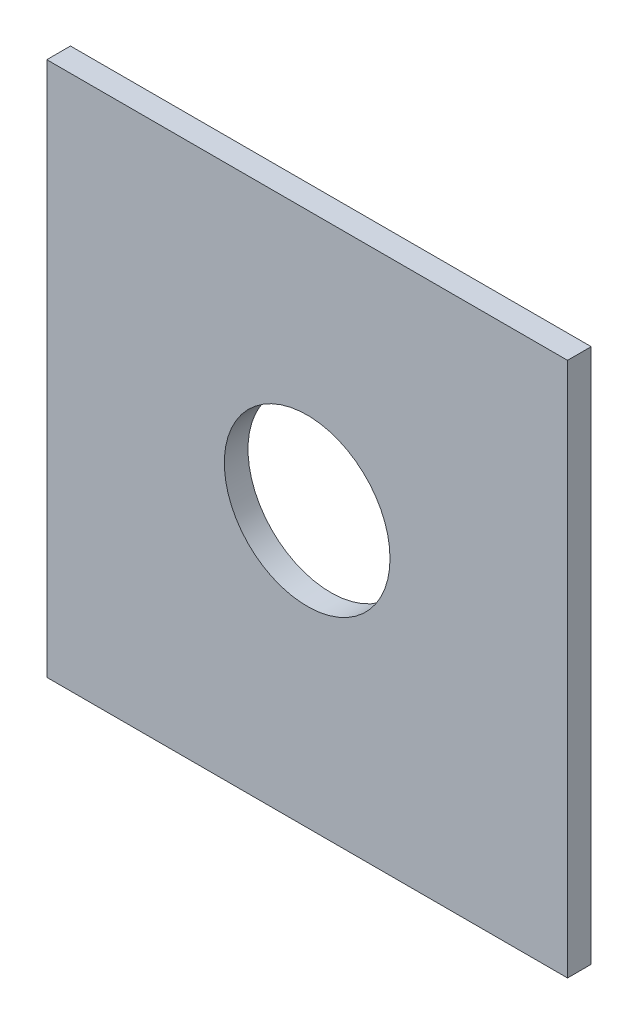
ISO-10303-21;
HEADER;
FILE_DESCRIPTION(('STEP AP214'),'2;1');
FILE_NAME('part.step','',(''),(''),'','','');
FILE_SCHEMA(('AUTOMOTIVE_DESIGN { 1 0 10303 214 1 1 1 1 }'));
ENDSEC;
DATA;
#1=APPLICATION_CONTEXT('core data for automotive mechanical design processes');
#2=APPLICATION_PROTOCOL_DEFINITION('international standard','automotive_design',2000,#1);
#3=PRODUCT_CONTEXT('',#1,'mechanical');
#4=PRODUCT('Part','Part','',(#3));
#5=PRODUCT_RELATED_PRODUCT_CATEGORY('part','',(#4));
#6=PRODUCT_DEFINITION_FORMATION('','',#4);
#7=PRODUCT_DEFINITION_CONTEXT('part definition',#1,'design');
#8=PRODUCT_DEFINITION('design','',#6,#7);
#9=PRODUCT_DEFINITION_SHAPE('','',#8);
#10=(LENGTH_UNIT() NAMED_UNIT(*) SI_UNIT(.MILLI.,.METRE.));
#11=(NAMED_UNIT(*) PLANE_ANGLE_UNIT() SI_UNIT($,.RADIAN.));
#12=(NAMED_UNIT(*) SI_UNIT($,.STERADIAN.) SOLID_ANGLE_UNIT());
#13=UNCERTAINTY_MEASURE_WITH_UNIT(LENGTH_MEASURE(1.E-05),#10,'distance_accuracy_value','');
#14=(GEOMETRIC_REPRESENTATION_CONTEXT(3) GLOBAL_UNCERTAINTY_ASSIGNED_CONTEXT((#13)) GLOBAL_UNIT_ASSIGNED_CONTEXT((#10,
#11,#12)) REPRESENTATION_CONTEXT('',''));
#15=CARTESIAN_POINT('',(0.,0.,0.));
#16=DIRECTION('',(0.,0.,1.));
#17=DIRECTION('',(1.,0.,0.));
#18=AXIS2_PLACEMENT_3D('',#15,#16,#17);
#19=CARTESIAN_POINT('',(0.,0.,-11.));
#20=DIRECTION('',(0.,0.,1.));
#21=DIRECTION('',(1.,0.,0.));
#22=AXIS2_PLACEMENT_3D('',#19,#20,#21);
#23=CYLINDRICAL_SURFACE('',#22,35.);
#24=DIRECTION('',(0.,0.,1.));
#25=VECTOR('',#24,1.);
#26=CARTESIAN_POINT('',(35.,0.,-11.));
#27=LINE('',#26,#25);
#28=CARTESIAN_POINT('',(35.,0.,-10.));
#29=VERTEX_POINT('',#28);
#30=CARTESIAN_POINT('',(35.,0.,0.));
#31=VERTEX_POINT('',#30);
#32=EDGE_CURVE('E10',#29,#31,#27,.T.);
#33=ORIENTED_EDGE('',*,*,#32,.F.);
#34=CARTESIAN_POINT('',(0.,0.,-10.));
#35=DIRECTION('',(0.,0.,1.));
#36=DIRECTION('',(1.,0.,0.));
#37=AXIS2_PLACEMENT_3D('',#34,#35,#36);
#38=CIRCLE('',#37,35.);
#39=EDGE_CURVE('E27',#29,#29,#38,.T.);
#40=ORIENTED_EDGE('',*,*,#39,.F.);
#41=ORIENTED_EDGE('',*,*,#32,.T.);
#42=CARTESIAN_POINT('',(0.,0.,0.));
#43=DIRECTION('',(0.,0.,1.));
#44=DIRECTION('',(1.,0.,0.));
#45=AXIS2_PLACEMENT_3D('',#42,#43,#44);
#46=CIRCLE('',#45,35.);
#47=EDGE_CURVE('E88',#31,#31,#46,.T.);
#48=ORIENTED_EDGE('',*,*,#47,.T.);
#49=EDGE_LOOP('',(#33,#40,#41,#48));
#50=FACE_BOUND('',#49,.T.);
#51=ADVANCED_FACE('F16',(#50),#23,.F.);
#52=CARTESIAN_POINT('',(110.,-116.,-10.));
#53=DIRECTION('',(1.,0.,0.));
#54=DIRECTION('',(0.,1.,0.));
#55=AXIS2_PLACEMENT_3D('',#52,#53,#54);
#56=PLANE('',#55);
#57=DIRECTION('',(0.,0.,1.));
#58=VECTOR('',#57,1.);
#59=CARTESIAN_POINT('',(110.,-116.,-10.));
#60=LINE('',#59,#58);
#61=CARTESIAN_POINT('',(110.,-116.,-10.));
#62=VERTEX_POINT('',#61);
#63=CARTESIAN_POINT('',(110.,-116.,0.));
#64=VERTEX_POINT('',#63);
#65=EDGE_CURVE('E107',#62,#64,#60,.T.);
#66=ORIENTED_EDGE('',*,*,#65,.F.);
#67=DIRECTION('',(0.,1.,0.));
#68=VECTOR('',#67,1.);
#69=CARTESIAN_POINT('',(110.,-116.,-10.));
#70=LINE('',#69,#68);
#71=CARTESIAN_POINT('',(110.,110.,-10.));
#72=VERTEX_POINT('',#71);
#73=EDGE_CURVE('E20',#62,#72,#70,.T.);
#74=ORIENTED_EDGE('',*,*,#73,.T.);
#75=DIRECTION('',(0.,0.,1.));
#76=VECTOR('',#75,1.);
#77=CARTESIAN_POINT('',(110.,110.,-10.));
#78=LINE('',#77,#76);
#79=CARTESIAN_POINT('',(110.,110.,0.));
#80=VERTEX_POINT('',#79);
#81=EDGE_CURVE('E85',#72,#80,#78,.T.);
#82=ORIENTED_EDGE('',*,*,#81,.T.);
#83=DIRECTION('',(0.,1.,0.));
#84=VECTOR('',#83,1.);
#85=CARTESIAN_POINT('',(110.,-116.,0.));
#86=LINE('',#85,#84);
#87=EDGE_CURVE('E100',#64,#80,#86,.T.);
#88=ORIENTED_EDGE('',*,*,#87,.F.);
#89=EDGE_LOOP('',(#66,#74,#82,#88));
#90=FACE_BOUND('',#89,.T.);
#91=ADVANCED_FACE('F130',(#90),#56,.T.);
#92=CARTESIAN_POINT('',(-110.,-116.,-10.));
#93=DIRECTION('',(0.,0.,1.));
#94=DIRECTION('',(1.,0.,0.));
#95=AXIS2_PLACEMENT_3D('',#92,#93,#94);
#96=PLANE('',#95);
#97=ORIENTED_EDGE('',*,*,#39,.T.);
#98=EDGE_LOOP('',(#97));
#99=FACE_BOUND('',#98,.T.);
#100=DIRECTION('',(1.,0.,0.));
#101=VECTOR('',#100,1.);
#102=CARTESIAN_POINT('',(-110.,110.,-10.));
#103=LINE('',#102,#101);
#104=CARTESIAN_POINT('',(-110.,110.,-10.));
#105=VERTEX_POINT('',#104);
#106=EDGE_CURVE('E116',#105,#72,#103,.T.);
#107=ORIENTED_EDGE('',*,*,#106,.T.);
#108=ORIENTED_EDGE('',*,*,#73,.F.);
#109=DIRECTION('',(1.,0.,0.));
#110=VECTOR('',#109,1.);
#111=CARTESIAN_POINT('',(-110.,-116.,-10.));
#112=LINE('',#111,#110);
#113=CARTESIAN_POINT('',(-110.,-116.,-10.));
#114=VERTEX_POINT('',#113);
#115=EDGE_CURVE('E98',#114,#62,#112,.T.);
#116=ORIENTED_EDGE('',*,*,#115,.F.);
#117=DIRECTION('',(0.,1.,0.));
#118=VECTOR('',#117,1.);
#119=CARTESIAN_POINT('',(-110.,-116.,-10.));
#120=LINE('',#119,#118);
#121=EDGE_CURVE('E158',#114,#105,#120,.T.);
#122=ORIENTED_EDGE('',*,*,#121,.T.);
#123=EDGE_LOOP('',(#107,#108,#116,#122));
#124=FACE_BOUND('',#123,.T.);
#125=ADVANCED_FACE('F147',(#99,#124),#96,.F.);
#126=CARTESIAN_POINT('',(-110.,110.,-10.));
#127=DIRECTION('',(0.,1.,0.));
#128=DIRECTION('',(1.,0.,0.));
#129=AXIS2_PLACEMENT_3D('',#126,#127,#128);
#130=PLANE('',#129);
#131=ORIENTED_EDGE('',*,*,#106,.F.);
#132=DIRECTION('',(0.,0.,1.));
#133=VECTOR('',#132,1.);
#134=CARTESIAN_POINT('',(-110.,110.,-10.));
#135=LINE('',#134,#133);
#136=CARTESIAN_POINT('',(-110.,110.,0.));
#137=VERTEX_POINT('',#136);
#138=EDGE_CURVE('E127',#105,#137,#135,.T.);
#139=ORIENTED_EDGE('',*,*,#138,.T.);
#140=DIRECTION('',(1.,0.,0.));
#141=VECTOR('',#140,1.);
#142=CARTESIAN_POINT('',(-110.,110.,0.));
#143=LINE('',#142,#141);
#144=EDGE_CURVE('E62',#137,#80,#143,.T.);
#145=ORIENTED_EDGE('',*,*,#144,.T.);
#146=ORIENTED_EDGE('',*,*,#81,.F.);
#147=EDGE_LOOP('',(#131,#139,#145,#146));
#148=FACE_BOUND('',#147,.T.);
#149=ADVANCED_FACE('F125',(#148),#130,.T.);
#150=CARTESIAN_POINT('',(-110.,-116.,0.));
#151=DIRECTION('',(0.,0.,1.));
#152=DIRECTION('',(1.,0.,0.));
#153=AXIS2_PLACEMENT_3D('',#150,#151,#152);
#154=PLANE('',#153);
#155=ORIENTED_EDGE('',*,*,#47,.F.);
#156=EDGE_LOOP('',(#155));
#157=FACE_BOUND('',#156,.T.);
#158=DIRECTION('',(0.,1.,0.));
#159=VECTOR('',#158,1.);
#160=CARTESIAN_POINT('',(-110.,-116.,0.));
#161=LINE('',#160,#159);
#162=CARTESIAN_POINT('',(-110.,-116.,0.));
#163=VERTEX_POINT('',#162);
#164=EDGE_CURVE('E161',#163,#137,#161,.T.);
#165=ORIENTED_EDGE('',*,*,#164,.F.);
#166=DIRECTION('',(1.,0.,0.));
#167=VECTOR('',#166,1.);
#168=CARTESIAN_POINT('',(-110.,-116.,0.));
#169=LINE('',#168,#167);
#170=EDGE_CURVE('E77',#163,#64,#169,.T.);
#171=ORIENTED_EDGE('',*,*,#170,.T.);
#172=ORIENTED_EDGE('',*,*,#87,.T.);
#173=ORIENTED_EDGE('',*,*,#144,.F.);
#174=EDGE_LOOP('',(#165,#171,#172,#173));
#175=FACE_BOUND('',#174,.T.);
#176=ADVANCED_FACE('F129',(#157,#175),#154,.T.);
#177=CARTESIAN_POINT('',(-110.,-116.,-10.));
#178=DIRECTION('',(0.,1.,0.));
#179=DIRECTION('',(1.,0.,0.));
#180=AXIS2_PLACEMENT_3D('',#177,#178,#179);
#181=PLANE('',#180);
#182=ORIENTED_EDGE('',*,*,#65,.T.);
#183=ORIENTED_EDGE('',*,*,#170,.F.);
#184=DIRECTION('',(0.,0.,1.));
#185=VECTOR('',#184,1.);
#186=CARTESIAN_POINT('',(-110.,-116.,-10.));
#187=LINE('',#186,#185);
#188=EDGE_CURVE('E111',#114,#163,#187,.T.);
#189=ORIENTED_EDGE('',*,*,#188,.F.);
#190=ORIENTED_EDGE('',*,*,#115,.T.);
#191=EDGE_LOOP('',(#182,#183,#189,#190));
#192=FACE_BOUND('',#191,.T.);
#193=ADVANCED_FACE('F18',(#192),#181,.F.);
#194=CARTESIAN_POINT('',(-110.,-116.,-10.));
#195=DIRECTION('',(1.,0.,0.));
#196=DIRECTION('',(0.,1.,0.));
#197=AXIS2_PLACEMENT_3D('',#194,#195,#196);
#198=PLANE('',#197);
#199=ORIENTED_EDGE('',*,*,#164,.T.);
#200=ORIENTED_EDGE('',*,*,#138,.F.);
#201=ORIENTED_EDGE('',*,*,#121,.F.);
#202=ORIENTED_EDGE('',*,*,#188,.T.);
#203=EDGE_LOOP('',(#199,#200,#201,#202));
#204=FACE_BOUND('',#203,.T.);
#205=ADVANCED_FACE('F133',(#204),#198,.F.);
#206=CLOSED_SHELL('',(#51,#91,#125,#149,#176,#193,#205));
#207=MANIFOLD_SOLID_BREP('B1',#206);
#208=ADVANCED_BREP_SHAPE_REPRESENTATION('',(#18,#207),#14);
#209=SHAPE_DEFINITION_REPRESENTATION(#9,#208);
ENDSEC;
END-ISO-10303-21;
